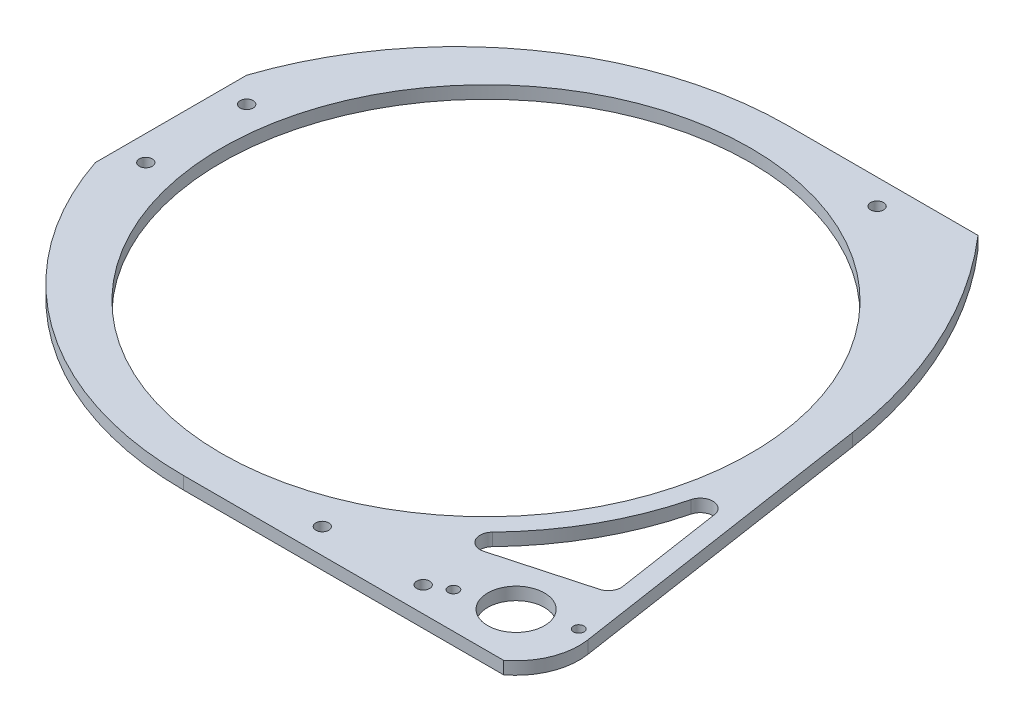
ISO-10303-21;
HEADER;
FILE_DESCRIPTION(('STEP AP214'),'2;1');
FILE_NAME('part.step','',(''),(''),'','','');
FILE_SCHEMA(('AUTOMOTIVE_DESIGN { 1 0 10303 214 1 1 1 1 }'));
ENDSEC;
DATA;
#1=APPLICATION_CONTEXT('core data for automotive mechanical design processes');
#2=APPLICATION_PROTOCOL_DEFINITION('international standard','automotive_design',2000,#1);
#3=PRODUCT_CONTEXT('',#1,'mechanical');
#4=PRODUCT('Part','Part','',(#3));
#5=PRODUCT_RELATED_PRODUCT_CATEGORY('part','',(#4));
#6=PRODUCT_DEFINITION_FORMATION('','',#4);
#7=PRODUCT_DEFINITION_CONTEXT('part definition',#1,'design');
#8=PRODUCT_DEFINITION('design','',#6,#7);
#9=PRODUCT_DEFINITION_SHAPE('','',#8);
#10=(LENGTH_UNIT() NAMED_UNIT(*) SI_UNIT(.MILLI.,.METRE.));
#11=(NAMED_UNIT(*) PLANE_ANGLE_UNIT() SI_UNIT($,.RADIAN.));
#12=(NAMED_UNIT(*) SI_UNIT($,.STERADIAN.) SOLID_ANGLE_UNIT());
#13=UNCERTAINTY_MEASURE_WITH_UNIT(LENGTH_MEASURE(1.E-05),#10,'distance_accuracy_value','');
#14=(GEOMETRIC_REPRESENTATION_CONTEXT(3) GLOBAL_UNCERTAINTY_ASSIGNED_CONTEXT((#13)) GLOBAL_UNIT_ASSIGNED_CONTEXT((#10,
#11,#12)) REPRESENTATION_CONTEXT('',''));
#15=CARTESIAN_POINT('',(0.,0.,0.));
#16=DIRECTION('',(0.,0.,1.));
#17=DIRECTION('',(1.,0.,0.));
#18=AXIS2_PLACEMENT_3D('',#15,#16,#17);
#19=CARTESIAN_POINT('',(-79.7640612472225,6.35,3.44169137633799E-12));
#20=DIRECTION('',(0.,-1.,0.));
#21=DIRECTION('',(0.,0.,-1.));
#22=AXIS2_PLACEMENT_3D('',#19,#20,#21);
#23=CYLINDRICAL_SURFACE('',#22,232.164061247223);
#24=CARTESIAN_POINT('',(-79.7640612472225,0.,3.44169137633799E-12));
#25=DIRECTION('',(0.,1.,0.));
#26=DIRECTION('',(0.,0.,1.));
#27=AXIS2_PLACEMENT_3D('',#24,#25,#26);
#28=CIRCLE('',#27,232.164061247223);
#29=CARTESIAN_POINT('',(95.377,0.,-152.4));
#30=VERTEX_POINT('',#29);
#31=CARTESIAN_POINT('',(149.78502738922,0.,-34.7471904041549));
#32=VERTEX_POINT('',#31);
#33=EDGE_CURVE('E147',#30,#32,#28,.F.);
#34=ORIENTED_EDGE('',*,*,#33,.F.);
#35=DIRECTION('',(0.,-1.,0.));
#36=VECTOR('',#35,1.);
#37=CARTESIAN_POINT('',(95.377,6.35,-152.4));
#38=LINE('',#37,#36);
#39=CARTESIAN_POINT('',(95.377,6.35,-152.4));
#40=VERTEX_POINT('',#39);
#41=EDGE_CURVE('E143',#40,#30,#38,.T.);
#42=ORIENTED_EDGE('',*,*,#41,.F.);
#43=CARTESIAN_POINT('',(-79.7640612472225,6.35,3.44169137633799E-12));
#44=DIRECTION('',(0.,1.,0.));
#45=DIRECTION('',(0.,0.,1.));
#46=AXIS2_PLACEMENT_3D('',#43,#44,#45);
#47=CIRCLE('',#46,232.164061247223);
#48=CARTESIAN_POINT('',(149.78502738922,6.35,-34.7471904041549));
#49=VERTEX_POINT('',#48);
#50=EDGE_CURVE('E145',#40,#49,#47,.F.);
#51=ORIENTED_EDGE('',*,*,#50,.T.);
#52=DIRECTION('',(0.,-1.,0.));
#53=VECTOR('',#52,1.);
#54=CARTESIAN_POINT('',(149.78502738922,6.35,-34.7471904041549));
#55=LINE('',#54,#53);
#56=EDGE_CURVE('E226',#49,#32,#55,.T.);
#57=ORIENTED_EDGE('',*,*,#56,.T.);
#58=EDGE_LOOP('',(#34,#42,#51,#57));
#59=FACE_BOUND('',#58,.T.);
#60=ADVANCED_FACE('F41',(#59),#23,.T.);
#61=CARTESIAN_POINT('',(0.,6.35,-152.4));
#62=DIRECTION('',(0.,0.,-1.));
#63=DIRECTION('',(-1.,0.,0.));
#64=AXIS2_PLACEMENT_3D('',#61,#62,#63);
#65=PLANE('',#64);
#66=DIRECTION('',(1.,0.,0.));
#67=VECTOR('',#66,1.);
#68=CARTESIAN_POINT('',(0.,0.,-152.4));
#69=LINE('',#68,#67);
#70=CARTESIAN_POINT('',(-5.25062936015364E-13,0.,-152.4));
#71=VERTEX_POINT('',#70);
#72=EDGE_CURVE('E234',#71,#30,#69,.T.);
#73=ORIENTED_EDGE('',*,*,#72,.F.);
#74=DIRECTION('',(0.,-1.,0.));
#75=VECTOR('',#74,1.);
#76=CARTESIAN_POINT('',(-5.25062936015364E-13,6.35,-152.4));
#77=LINE('',#76,#75);
#78=CARTESIAN_POINT('',(-5.25062936015364E-13,6.35,-152.4));
#79=VERTEX_POINT('',#78);
#80=EDGE_CURVE('E154',#79,#71,#77,.T.);
#81=ORIENTED_EDGE('',*,*,#80,.F.);
#82=DIRECTION('',(1.,0.,0.));
#83=VECTOR('',#82,1.);
#84=CARTESIAN_POINT('',(0.,6.35,-152.4));
#85=LINE('',#84,#83);
#86=EDGE_CURVE('E161',#79,#40,#85,.T.);
#87=ORIENTED_EDGE('',*,*,#86,.T.);
#88=ORIENTED_EDGE('',*,*,#41,.T.);
#89=EDGE_LOOP('',(#73,#81,#87,#88));
#90=FACE_BOUND('',#89,.T.);
#91=ADVANCED_FACE('F169',(#90),#65,.T.);
#92=CARTESIAN_POINT('',(0.,6.35,14.8167372222222));
#93=DIRECTION('',(0.,-1.,0.));
#94=DIRECTION('',(0.,0.,-1.));
#95=AXIS2_PLACEMENT_3D('',#92,#93,#94);
#96=CYLINDRICAL_SURFACE('',#95,167.216737222222);
#97=CARTESIAN_POINT('',(0.,0.,14.8167372222222));
#98=DIRECTION('',(0.,1.,0.));
#99=DIRECTION('',(0.,0.,1.));
#100=AXIS2_PLACEMENT_3D('',#97,#98,#99);
#101=CIRCLE('',#100,167.216737222222);
#102=CARTESIAN_POINT('',(-158.623,0.,-38.1));
#103=VERTEX_POINT('',#102);
#104=EDGE_CURVE('E237',#103,#71,#101,.F.);
#105=ORIENTED_EDGE('',*,*,#104,.F.);
#106=DIRECTION('',(0.,-1.,0.));
#107=VECTOR('',#106,1.);
#108=CARTESIAN_POINT('',(-158.623,6.35,-38.1));
#109=LINE('',#108,#107);
#110=CARTESIAN_POINT('',(-158.623,6.35,-38.1));
#111=VERTEX_POINT('',#110);
#112=EDGE_CURVE('E311',#111,#103,#109,.T.);
#113=ORIENTED_EDGE('',*,*,#112,.F.);
#114=CARTESIAN_POINT('',(0.,6.35,14.8167372222222));
#115=DIRECTION('',(0.,1.,0.));
#116=DIRECTION('',(0.,0.,1.));
#117=AXIS2_PLACEMENT_3D('',#114,#115,#116);
#118=CIRCLE('',#117,167.216737222222);
#119=EDGE_CURVE('E171',#111,#79,#118,.F.);
#120=ORIENTED_EDGE('',*,*,#119,.T.);
#121=ORIENTED_EDGE('',*,*,#80,.T.);
#122=EDGE_LOOP('',(#105,#113,#120,#121));
#123=FACE_BOUND('',#122,.T.);
#124=ADVANCED_FACE('F403',(#123),#96,.T.);
#125=CARTESIAN_POINT('',(-158.623,6.35,0.));
#126=DIRECTION('',(1.,0.,0.));
#127=DIRECTION('',(0.,0.,-1.));
#128=AXIS2_PLACEMENT_3D('',#125,#126,#127);
#129=PLANE('',#128);
#130=DIRECTION('',(0.,0.,1.));
#131=VECTOR('',#130,1.);
#132=CARTESIAN_POINT('',(-158.623,0.,0.));
#133=LINE('',#132,#131);
#134=CARTESIAN_POINT('',(-158.623,0.,38.1));
#135=VERTEX_POINT('',#134);
#136=EDGE_CURVE('E241',#103,#135,#133,.T.);
#137=ORIENTED_EDGE('',*,*,#136,.T.);
#138=DIRECTION('',(0.,-1.,0.));
#139=VECTOR('',#138,1.);
#140=CARTESIAN_POINT('',(-158.623,6.35,38.1));
#141=LINE('',#140,#139);
#142=CARTESIAN_POINT('',(-158.623,6.35,38.1));
#143=VERTEX_POINT('',#142);
#144=EDGE_CURVE('E307',#143,#135,#141,.T.);
#145=ORIENTED_EDGE('',*,*,#144,.F.);
#146=DIRECTION('',(0.,0.,1.));
#147=VECTOR('',#146,1.);
#148=CARTESIAN_POINT('',(-158.623,6.35,0.));
#149=LINE('',#148,#147);
#150=EDGE_CURVE('E174',#111,#143,#149,.T.);
#151=ORIENTED_EDGE('',*,*,#150,.F.);
#152=ORIENTED_EDGE('',*,*,#112,.T.);
#153=EDGE_LOOP('',(#137,#145,#151,#152));
#154=FACE_BOUND('',#153,.T.);
#155=ADVANCED_FACE('F566',(#154),#129,.F.);
#156=CARTESIAN_POINT('',(0.,6.35,-14.8167372222222));
#157=DIRECTION('',(0.,-1.,0.));
#158=DIRECTION('',(0.,0.,-1.));
#159=AXIS2_PLACEMENT_3D('',#156,#157,#158);
#160=CYLINDRICAL_SURFACE('',#159,167.216737222222);
#161=CARTESIAN_POINT('',(0.,0.,-14.8167372222222));
#162=DIRECTION('',(0.,1.,0.));
#163=DIRECTION('',(0.,0.,1.));
#164=AXIS2_PLACEMENT_3D('',#161,#162,#163);
#165=CIRCLE('',#164,167.216737222222);
#166=CARTESIAN_POINT('',(5.25062942183422E-13,0.,152.4));
#167=VERTEX_POINT('',#166);
#168=EDGE_CURVE('E245',#135,#167,#165,.T.);
#169=ORIENTED_EDGE('',*,*,#168,.T.);
#170=DIRECTION('',(0.,-1.,0.));
#171=VECTOR('',#170,1.);
#172=CARTESIAN_POINT('',(5.25062942183422E-13,6.35,152.4));
#173=LINE('',#172,#171);
#174=CARTESIAN_POINT('',(5.25062942183422E-13,6.35,152.4));
#175=VERTEX_POINT('',#174);
#176=EDGE_CURVE('E303',#175,#167,#173,.T.);
#177=ORIENTED_EDGE('',*,*,#176,.F.);
#178=CARTESIAN_POINT('',(0.,6.35,-14.8167372222222));
#179=DIRECTION('',(0.,1.,0.));
#180=DIRECTION('',(0.,0.,1.));
#181=AXIS2_PLACEMENT_3D('',#178,#179,#180);
#182=CIRCLE('',#181,167.216737222222);
#183=EDGE_CURVE('E181',#143,#175,#182,.T.);
#184=ORIENTED_EDGE('',*,*,#183,.F.);
#185=ORIENTED_EDGE('',*,*,#144,.T.);
#186=EDGE_LOOP('',(#169,#177,#184,#185));
#187=FACE_BOUND('',#186,.T.);
#188=ADVANCED_FACE('F555',(#187),#160,.T.);
#189=CARTESIAN_POINT('',(0.,6.35,152.4));
#190=DIRECTION('',(0.,0.,-1.));
#191=DIRECTION('',(-1.,0.,0.));
#192=AXIS2_PLACEMENT_3D('',#189,#190,#191);
#193=PLANE('',#192);
#194=DIRECTION('',(1.,0.,0.));
#195=VECTOR('',#194,1.);
#196=CARTESIAN_POINT('',(0.,0.,152.4));
#197=LINE('',#196,#195);
#198=CARTESIAN_POINT('',(161.207253597175,0.,152.4));
#199=VERTEX_POINT('',#198);
#200=EDGE_CURVE('E249',#167,#199,#197,.T.);
#201=ORIENTED_EDGE('',*,*,#200,.T.);
#202=DIRECTION('',(0.,-1.,0.));
#203=VECTOR('',#202,1.);
#204=CARTESIAN_POINT('',(161.207253597175,6.35,152.4));
#205=LINE('',#204,#203);
#206=CARTESIAN_POINT('',(161.207253597175,6.35,152.4));
#207=VERTEX_POINT('',#206);
#208=EDGE_CURVE('E299',#207,#199,#205,.T.);
#209=ORIENTED_EDGE('',*,*,#208,.F.);
#210=DIRECTION('',(1.,0.,0.));
#211=VECTOR('',#210,1.);
#212=CARTESIAN_POINT('',(0.,6.35,152.4));
#213=LINE('',#212,#211);
#214=EDGE_CURVE('E185',#175,#207,#213,.T.);
#215=ORIENTED_EDGE('',*,*,#214,.F.);
#216=ORIENTED_EDGE('',*,*,#176,.T.);
#217=EDGE_LOOP('',(#201,#209,#215,#216));
#218=FACE_BOUND('',#217,.T.);
#219=ADVANCED_FACE('F545',(#218),#193,.F.);
#220=CARTESIAN_POINT('',(142.157253597175,6.35,127.));
#221=DIRECTION('',(0.,-1.,0.));
#222=DIRECTION('',(0.,0.,-1.));
#223=AXIS2_PLACEMENT_3D('',#220,#221,#222);
#224=CYLINDRICAL_SURFACE('',#223,31.75);
#225=CARTESIAN_POINT('',(142.157253597175,0.,127.));
#226=DIRECTION('',(0.,1.,0.));
#227=DIRECTION('',(0.,0.,1.));
#228=AXIS2_PLACEMENT_3D('',#225,#226,#227);
#229=CIRCLE('',#228,31.75);
#230=CARTESIAN_POINT('',(173.549638469553,0.,122.248087540314));
#231=VERTEX_POINT('',#230);
#232=EDGE_CURVE('E253',#199,#231,#229,.T.);
#233=ORIENTED_EDGE('',*,*,#232,.T.);
#234=DIRECTION('',(0.,-1.,0.));
#235=VECTOR('',#234,1.);
#236=CARTESIAN_POINT('',(173.549638469553,6.35,122.248087540314));
#237=LINE('',#236,#235);
#238=CARTESIAN_POINT('',(173.549638469553,6.35,122.248087540314));
#239=VERTEX_POINT('',#238);
#240=EDGE_CURVE('E295',#239,#231,#237,.T.);
#241=ORIENTED_EDGE('',*,*,#240,.F.);
#242=CARTESIAN_POINT('',(142.157253597175,6.35,127.));
#243=DIRECTION('',(0.,1.,0.));
#244=DIRECTION('',(0.,0.,1.));
#245=AXIS2_PLACEMENT_3D('',#242,#243,#244);
#246=CIRCLE('',#245,31.75);
#247=EDGE_CURVE('E189',#207,#239,#246,.T.);
#248=ORIENTED_EDGE('',*,*,#247,.F.);
#249=ORIENTED_EDGE('',*,*,#208,.T.);
#250=EDGE_LOOP('',(#233,#241,#248,#249));
#251=FACE_BOUND('',#250,.T.);
#252=ADVANCED_FACE('F535',(#251),#224,.T.);
#253=CARTESIAN_POINT('',(-145.923,6.35,-25.4));
#254=DIRECTION('',(0.,-1.,0.));
#255=DIRECTION('',(0.,0.,-1.));
#256=AXIS2_PLACEMENT_3D('',#253,#254,#255);
#257=CYLINDRICAL_SURFACE('',#256,3.26390000000001);
#258=CARTESIAN_POINT('',(-145.923,6.35,-25.4));
#259=DIRECTION('',(0.,1.,0.));
#260=DIRECTION('',(0.,0.,1.));
#261=AXIS2_PLACEMENT_3D('',#258,#259,#260);
#262=CIRCLE('',#261,3.26390000000001);
#263=CARTESIAN_POINT('',(-145.923,6.35,-22.1361));
#264=VERTEX_POINT('',#263);
#265=EDGE_CURVE('E218',#264,#264,#262,.T.);
#266=ORIENTED_EDGE('',*,*,#265,.T.);
#267=EDGE_LOOP('',(#266));
#268=FACE_BOUND('',#267,.T.);
#269=CARTESIAN_POINT('',(-145.923,0.,-25.4));
#270=DIRECTION('',(0.,1.,0.));
#271=DIRECTION('',(0.,0.,1.));
#272=AXIS2_PLACEMENT_3D('',#269,#270,#271);
#273=CIRCLE('',#272,3.26390000000001);
#274=CARTESIAN_POINT('',(-145.923,0.,-22.1361));
#275=VERTEX_POINT('',#274);
#276=EDGE_CURVE('E285',#275,#275,#273,.T.);
#277=ORIENTED_EDGE('',*,*,#276,.F.);
#278=EDGE_LOOP('',(#277));
#279=FACE_BOUND('',#278,.T.);
#280=ADVANCED_FACE('F525',(#268,#279),#257,.F.);
#281=CARTESIAN_POINT('',(-145.923,6.35,25.4));
#282=DIRECTION('',(0.,-1.,0.));
#283=DIRECTION('',(0.,0.,-1.));
#284=AXIS2_PLACEMENT_3D('',#281,#282,#283);
#285=CYLINDRICAL_SURFACE('',#284,3.26390000000001);
#286=CARTESIAN_POINT('',(-145.923,6.35,25.4));
#287=DIRECTION('',(0.,1.,0.));
#288=DIRECTION('',(0.,0.,1.));
#289=AXIS2_PLACEMENT_3D('',#286,#287,#288);
#290=CIRCLE('',#289,3.26390000000001);
#291=CARTESIAN_POINT('',(-145.923,6.35,28.6639));
#292=VERTEX_POINT('',#291);
#293=EDGE_CURVE('E214',#292,#292,#290,.T.);
#294=ORIENTED_EDGE('',*,*,#293,.T.);
#295=EDGE_LOOP('',(#294));
#296=FACE_BOUND('',#295,.T.);
#297=CARTESIAN_POINT('',(-145.923,0.,25.4));
#298=DIRECTION('',(0.,1.,0.));
#299=DIRECTION('',(0.,0.,1.));
#300=AXIS2_PLACEMENT_3D('',#297,#298,#299);
#301=CIRCLE('',#300,3.26390000000001);
#302=CARTESIAN_POINT('',(-145.923,0.,28.6639));
#303=VERTEX_POINT('',#302);
#304=EDGE_CURVE('E281',#303,#303,#301,.T.);
#305=ORIENTED_EDGE('',*,*,#304,.F.);
#306=EDGE_LOOP('',(#305));
#307=FACE_BOUND('',#306,.T.);
#308=ADVANCED_FACE('F515',(#296,#307),#285,.F.);
#309=CARTESIAN_POINT('',(57.2769999999999,6.35,-139.7));
#310=DIRECTION('',(0.,-1.,0.));
#311=DIRECTION('',(0.,0.,-1.));
#312=AXIS2_PLACEMENT_3D('',#309,#310,#311);
#313=CYLINDRICAL_SURFACE('',#312,3.2639);
#314=CARTESIAN_POINT('',(57.2769999999999,6.35,-139.7));
#315=DIRECTION('',(0.,1.,0.));
#316=DIRECTION('',(0.,0.,1.));
#317=AXIS2_PLACEMENT_3D('',#314,#315,#316);
#318=CIRCLE('',#317,3.2639);
#319=CARTESIAN_POINT('',(57.2769999999999,6.35,-136.4361));
#320=VERTEX_POINT('',#319);
#321=EDGE_CURVE('E210',#320,#320,#318,.T.);
#322=ORIENTED_EDGE('',*,*,#321,.T.);
#323=EDGE_LOOP('',(#322));
#324=FACE_BOUND('',#323,.T.);
#325=CARTESIAN_POINT('',(57.2769999999999,0.,-139.7));
#326=DIRECTION('',(0.,1.,0.));
#327=DIRECTION('',(0.,0.,1.));
#328=AXIS2_PLACEMENT_3D('',#325,#326,#327);
#329=CIRCLE('',#328,3.2639);
#330=CARTESIAN_POINT('',(57.2769999999999,0.,-136.4361));
#331=VERTEX_POINT('',#330);
#332=EDGE_CURVE('E277',#331,#331,#329,.T.);
#333=ORIENTED_EDGE('',*,*,#332,.F.);
#334=EDGE_LOOP('',(#333));
#335=FACE_BOUND('',#334,.T.);
#336=ADVANCED_FACE('F505',(#324,#335),#313,.F.);
#337=CARTESIAN_POINT('',(57.277,6.35,139.7));
#338=DIRECTION('',(0.,-1.,0.));
#339=DIRECTION('',(0.,0.,-1.));
#340=AXIS2_PLACEMENT_3D('',#337,#338,#339);
#341=CYLINDRICAL_SURFACE('',#340,3.2639);
#342=CARTESIAN_POINT('',(57.277,6.35,139.7));
#343=DIRECTION('',(0.,1.,0.));
#344=DIRECTION('',(0.,0.,1.));
#345=AXIS2_PLACEMENT_3D('',#342,#343,#344);
#346=CIRCLE('',#345,3.2639);
#347=CARTESIAN_POINT('',(57.277,6.35,142.9639));
#348=VERTEX_POINT('',#347);
#349=EDGE_CURVE('E206',#348,#348,#346,.T.);
#350=ORIENTED_EDGE('',*,*,#349,.T.);
#351=EDGE_LOOP('',(#350));
#352=FACE_BOUND('',#351,.T.);
#353=CARTESIAN_POINT('',(57.277,0.,139.7));
#354=DIRECTION('',(0.,1.,0.));
#355=DIRECTION('',(0.,0.,1.));
#356=AXIS2_PLACEMENT_3D('',#353,#354,#355);
#357=CIRCLE('',#356,3.2639);
#358=CARTESIAN_POINT('',(57.277,0.,142.9639));
#359=VERTEX_POINT('',#358);
#360=EDGE_CURVE('E273',#359,#359,#357,.T.);
#361=ORIENTED_EDGE('',*,*,#360,.F.);
#362=EDGE_LOOP('',(#361));
#363=FACE_BOUND('',#362,.T.);
#364=ADVANCED_FACE('F495',(#352,#363),#341,.F.);
#365=CARTESIAN_POINT('',(117.797598231343,6.35,134.194942005177));
#366=DIRECTION('',(0.,-1.,0.));
#367=DIRECTION('',(0.,0.,-1.));
#368=AXIS2_PLACEMENT_3D('',#365,#366,#367);
#369=CYLINDRICAL_SURFACE('',#368,2.62890000000002);
#370=CARTESIAN_POINT('',(117.797598231343,6.35,134.194942005177));
#371=DIRECTION('',(0.,1.,0.));
#372=DIRECTION('',(0.,0.,1.));
#373=AXIS2_PLACEMENT_3D('',#370,#371,#372);
#374=CIRCLE('',#373,2.62890000000002);
#375=CARTESIAN_POINT('',(117.797598231343,6.35,136.823842005177));
#376=VERTEX_POINT('',#375);
#377=EDGE_CURVE('E202',#376,#376,#374,.T.);
#378=ORIENTED_EDGE('',*,*,#377,.T.);
#379=EDGE_LOOP('',(#378));
#380=FACE_BOUND('',#379,.T.);
#381=CARTESIAN_POINT('',(117.797598231343,0.,134.194942005177));
#382=DIRECTION('',(0.,1.,0.));
#383=DIRECTION('',(0.,0.,1.));
#384=AXIS2_PLACEMENT_3D('',#381,#382,#383);
#385=CIRCLE('',#384,2.62890000000002);
#386=CARTESIAN_POINT('',(117.797598231343,0.,136.823842005177));
#387=VERTEX_POINT('',#386);
#388=EDGE_CURVE('E269',#387,#387,#385,.T.);
#389=ORIENTED_EDGE('',*,*,#388,.F.);
#390=EDGE_LOOP('',(#389));
#391=FACE_BOUND('',#390,.T.);
#392=ADVANCED_FACE('F485',(#380,#391),#369,.F.);
#393=CARTESIAN_POINT('',(166.516908963008,6.35,119.805057994823));
#394=DIRECTION('',(0.,-1.,0.));
#395=DIRECTION('',(0.,0.,-1.));
#396=AXIS2_PLACEMENT_3D('',#393,#394,#395);
#397=CYLINDRICAL_SURFACE('',#396,2.62890000000002);
#398=CARTESIAN_POINT('',(166.516908963008,6.35,119.805057994823));
#399=DIRECTION('',(0.,1.,0.));
#400=DIRECTION('',(0.,0.,1.));
#401=AXIS2_PLACEMENT_3D('',#398,#399,#400);
#402=CIRCLE('',#401,2.62890000000002);
#403=CARTESIAN_POINT('',(166.516908963008,6.35,122.433957994823));
#404=VERTEX_POINT('',#403);
#405=EDGE_CURVE('E198',#404,#404,#402,.T.);
#406=ORIENTED_EDGE('',*,*,#405,.T.);
#407=EDGE_LOOP('',(#406));
#408=FACE_BOUND('',#407,.T.);
#409=CARTESIAN_POINT('',(166.516908963008,0.,119.805057994823));
#410=DIRECTION('',(0.,1.,0.));
#411=DIRECTION('',(0.,0.,1.));
#412=AXIS2_PLACEMENT_3D('',#409,#410,#411);
#413=CIRCLE('',#412,2.62890000000002);
#414=CARTESIAN_POINT('',(166.516908963008,0.,122.433957994823));
#415=VERTEX_POINT('',#414);
#416=EDGE_CURVE('E265',#415,#415,#413,.T.);
#417=ORIENTED_EDGE('',*,*,#416,.F.);
#418=EDGE_LOOP('',(#417));
#419=FACE_BOUND('',#418,.T.);
#420=ADVANCED_FACE('F475',(#408,#419),#397,.F.);
#421=CARTESIAN_POINT('',(142.157253597175,6.35,127.));
#422=DIRECTION('',(0.,-1.,0.));
#423=DIRECTION('',(0.,0.,-1.));
#424=AXIS2_PLACEMENT_3D('',#421,#422,#423);
#425=CYLINDRICAL_SURFACE('',#424,14.2875);
#426=CARTESIAN_POINT('',(142.157253597175,6.35,127.));
#427=DIRECTION('',(0.,1.,0.));
#428=DIRECTION('',(0.,0.,1.));
#429=AXIS2_PLACEMENT_3D('',#426,#427,#428);
#430=CIRCLE('',#429,14.2875);
#431=CARTESIAN_POINT('',(142.157253597175,6.35,141.2875));
#432=VERTEX_POINT('',#431);
#433=EDGE_CURVE('E194',#432,#432,#430,.T.);
#434=ORIENTED_EDGE('',*,*,#433,.T.);
#435=EDGE_LOOP('',(#434));
#436=FACE_BOUND('',#435,.T.);
#437=CARTESIAN_POINT('',(142.157253597175,0.,127.));
#438=DIRECTION('',(0.,1.,0.));
#439=DIRECTION('',(0.,0.,1.));
#440=AXIS2_PLACEMENT_3D('',#437,#438,#439);
#441=CIRCLE('',#440,14.2875);
#442=CARTESIAN_POINT('',(142.157253597175,0.,141.2875));
#443=VERTEX_POINT('',#442);
#444=EDGE_CURVE('E261',#443,#443,#441,.T.);
#445=ORIENTED_EDGE('',*,*,#444,.F.);
#446=EDGE_LOOP('',(#445));
#447=FACE_BOUND('',#446,.T.);
#448=ADVANCED_FACE('F465',(#436,#447),#425,.F.);
#449=CARTESIAN_POINT('',(151.571748060178,6.35,-22.9436432138447));
#450=DIRECTION('',(-0.988736531413468,0.,0.149666534163335));
#451=DIRECTION('',(0.149666534163335,0.,0.988736531413468));
#452=AXIS2_PLACEMENT_3D('',#449,#450,#451);
#453=PLANE('',#452);
#454=DIRECTION('',(-0.149666534163335,0.,-0.988736531413468));
#455=VECTOR('',#454,1.);
#456=CARTESIAN_POINT('',(151.571748060178,0.,-22.9436432138447));
#457=LINE('',#456,#455);
#458=EDGE_CURVE('E257',#231,#32,#457,.T.);
#459=ORIENTED_EDGE('',*,*,#458,.T.);
#460=ORIENTED_EDGE('',*,*,#56,.F.);
#461=DIRECTION('',(-0.149666534163335,0.,-0.988736531413468));
#462=VECTOR('',#461,1.);
#463=CARTESIAN_POINT('',(151.571748060178,6.35,-22.9436432138447));
#464=LINE('',#463,#462);
#465=EDGE_CURVE('E164',#239,#49,#464,.T.);
#466=ORIENTED_EDGE('',*,*,#465,.F.);
#467=ORIENTED_EDGE('',*,*,#240,.T.);
#468=EDGE_LOOP('',(#459,#460,#466,#467));
#469=FACE_BOUND('',#468,.T.);
#470=ADVANCED_FACE('F409',(#469),#453,.F.);
#471=CARTESIAN_POINT('',(108.077,6.35,139.7));
#472=DIRECTION('',(0.,-1.,0.));
#473=DIRECTION('',(0.,0.,-1.));
#474=AXIS2_PLACEMENT_3D('',#471,#472,#473);
#475=CYLINDRICAL_SURFACE('',#474,3.26389999999999);
#476=CARTESIAN_POINT('',(108.077,6.35,139.7));
#477=DIRECTION('',(0.,1.,0.));
#478=DIRECTION('',(0.,0.,1.));
#479=AXIS2_PLACEMENT_3D('',#476,#477,#478);
#480=CIRCLE('',#479,3.26389999999999);
#481=CARTESIAN_POINT('',(108.077,6.35,142.9639));
#482=VERTEX_POINT('',#481);
#483=EDGE_CURVE('E167',#482,#482,#480,.T.);
#484=ORIENTED_EDGE('',*,*,#483,.T.);
#485=EDGE_LOOP('',(#484));
#486=FACE_BOUND('',#485,.T.);
#487=CARTESIAN_POINT('',(108.077,0.,139.7));
#488=DIRECTION('',(0.,1.,0.));
#489=DIRECTION('',(0.,0.,1.));
#490=AXIS2_PLACEMENT_3D('',#487,#488,#489);
#491=CIRCLE('',#490,3.26389999999999);
#492=CARTESIAN_POINT('',(108.077,0.,142.9639));
#493=VERTEX_POINT('',#492);
#494=EDGE_CURVE('E227',#493,#493,#491,.T.);
#495=ORIENTED_EDGE('',*,*,#494,.F.);
#496=EDGE_LOOP('',(#495));
#497=FACE_BOUND('',#496,.T.);
#498=ADVANCED_FACE('F384',(#486,#497),#475,.F.);
#499=CARTESIAN_POINT('',(0.,6.35,0.));
#500=DIRECTION('',(0.,-1.,0.));
#501=DIRECTION('',(0.,0.,-1.));
#502=AXIS2_PLACEMENT_3D('',#499,#500,#501);
#503=CYLINDRICAL_SURFACE('',#502,133.223);
#504=CARTESIAN_POINT('',(0.,6.35,0.));
#505=DIRECTION('',(0.,1.,0.));
#506=DIRECTION('',(0.,0.,1.));
#507=AXIS2_PLACEMENT_3D('',#504,#505,#506);
#508=CIRCLE('',#507,133.223);
#509=CARTESIAN_POINT('',(0.,6.35,133.223));
#510=VERTEX_POINT('',#509);
#511=EDGE_CURVE('E222',#510,#510,#508,.T.);
#512=ORIENTED_EDGE('',*,*,#511,.T.);
#513=EDGE_LOOP('',(#512));
#514=FACE_BOUND('',#513,.T.);
#515=CARTESIAN_POINT('',(0.,0.,0.));
#516=DIRECTION('',(0.,1.,0.));
#517=DIRECTION('',(0.,0.,1.));
#518=AXIS2_PLACEMENT_3D('',#515,#516,#517);
#519=CIRCLE('',#518,133.223);
#520=CARTESIAN_POINT('',(0.,0.,133.223));
#521=VERTEX_POINT('',#520);
#522=EDGE_CURVE('E289',#521,#521,#519,.T.);
#523=ORIENTED_EDGE('',*,*,#522,.F.);
#524=EDGE_LOOP('',(#523));
#525=FACE_BOUND('',#524,.T.);
#526=ADVANCED_FACE('F388',(#514,#525),#503,.F.);
#527=CARTESIAN_POINT('',(0.,6.35,0.));
#528=DIRECTION('',(0.,1.,0.));
#529=DIRECTION('',(0.,0.,1.));
#530=AXIS2_PLACEMENT_3D('',#527,#528,#529);
#531=PLANE('',#530);
#532=CARTESIAN_POINT('',(0.,6.35,0.));
#533=DIRECTION('',(0.,-1.,0.));
#534=DIRECTION('',(0.,0.,1.));
#535=AXIS2_PLACEMENT_3D('',#532,#533,#534);
#536=CIRCLE('',#535,142.748);
#537=CARTESIAN_POINT('',(138.376164520593,6.35,35.0575041406216));
#538=VERTEX_POINT('',#537);
#539=CARTESIAN_POINT('',(102.544438505482,6.35,99.3057381806078));
#540=VERTEX_POINT('',#539);
#541=EDGE_CURVE('E352',#538,#540,#536,.T.);
#542=ORIENTED_EDGE('',*,*,#541,.F.);
#543=CARTESIAN_POINT('',(144.53168785336,6.35,36.6170016557738));
#544=DIRECTION('',(0.,1.,0.));
#545=DIRECTION('',(0.,0.,1.));
#546=AXIS2_PLACEMENT_3D('',#543,#544,#545);
#547=CIRCLE('',#546,6.35);
#548=CARTESIAN_POINT('',(150.810164827835,6.35,35.6666191638367));
#549=VERTEX_POINT('',#548);
#550=EDGE_CURVE('E335',#538,#549,#547,.F.);
#551=ORIENTED_EDGE('',*,*,#550,.T.);
#552=DIRECTION('',(-0.149666534163335,0.,-0.988736531413468));
#553=VECTOR('',#552,1.);
#554=CARTESIAN_POINT('',(142.748,6.35,-17.5941644316346));
#555=LINE('',#554,#553);
#556=CARTESIAN_POINT('',(159.063326188936,6.35,90.1891761468455));
#557=VERTEX_POINT('',#556);
#558=EDGE_CURVE('E373',#557,#549,#555,.T.);
#559=ORIENTED_EDGE('',*,*,#558,.F.);
#560=CARTESIAN_POINT('',(152.78484921446,6.35,91.1395586387826));
#561=DIRECTION('',(0.,1.,0.));
#562=DIRECTION('',(0.,0.,1.));
#563=AXIS2_PLACEMENT_3D('',#560,#561,#562);
#564=CIRCLE('',#563,6.35);
#565=CARTESIAN_POINT('',(154.471336080676,6.35,97.26150784227));
#566=VERTEX_POINT('',#565);
#567=EDGE_CURVE('E341',#557,#566,#564,.F.);
#568=ORIENTED_EDGE('',*,*,#567,.T.);
#569=DIRECTION('',(0.964086488738167,0.,-0.265588482868727));
#570=VECTOR('',#569,1.);
#571=CARTESIAN_POINT('',(81.0963370257868,6.35,117.475));
#572=LINE('',#571,#570);
#573=CARTESIAN_POINT('',(108.792510714469,6.35,109.845202427716));
#574=VERTEX_POINT('',#573);
#575=EDGE_CURVE('E353',#574,#566,#572,.T.);
#576=ORIENTED_EDGE('',*,*,#575,.F.);
#577=CARTESIAN_POINT('',(107.106023848253,6.35,103.723253224229));
#578=DIRECTION('',(0.,1.,0.));
#579=DIRECTION('',(0.,0.,1.));
#580=AXIS2_PLACEMENT_3D('',#577,#578,#579);
#581=CIRCLE('',#580,6.35);
#582=EDGE_CURVE('E50',#574,#540,#581,.F.);
#583=ORIENTED_EDGE('',*,*,#582,.T.);
#584=EDGE_LOOP('',(#542,#551,#559,#568,#576,#583));
#585=FACE_BOUND('',#584,.T.);
#586=ORIENTED_EDGE('',*,*,#483,.F.);
#587=EDGE_LOOP('',(#586));
#588=FACE_BOUND('',#587,.T.);
#589=ORIENTED_EDGE('',*,*,#50,.F.);
#590=ORIENTED_EDGE('',*,*,#86,.F.);
#591=ORIENTED_EDGE('',*,*,#119,.F.);
#592=ORIENTED_EDGE('',*,*,#150,.T.);
#593=ORIENTED_EDGE('',*,*,#183,.T.);
#594=ORIENTED_EDGE('',*,*,#214,.T.);
#595=ORIENTED_EDGE('',*,*,#247,.T.);
#596=ORIENTED_EDGE('',*,*,#465,.T.);
#597=EDGE_LOOP('',(#589,#590,#591,#592,#593,#594,#595,#596));
#598=FACE_BOUND('',#597,.T.);
#599=ORIENTED_EDGE('',*,*,#433,.F.);
#600=EDGE_LOOP('',(#599));
#601=FACE_BOUND('',#600,.T.);
#602=ORIENTED_EDGE('',*,*,#405,.F.);
#603=EDGE_LOOP('',(#602));
#604=FACE_BOUND('',#603,.T.);
#605=ORIENTED_EDGE('',*,*,#377,.F.);
#606=EDGE_LOOP('',(#605));
#607=FACE_BOUND('',#606,.T.);
#608=ORIENTED_EDGE('',*,*,#349,.F.);
#609=EDGE_LOOP('',(#608));
#610=FACE_BOUND('',#609,.T.);
#611=ORIENTED_EDGE('',*,*,#321,.F.);
#612=EDGE_LOOP('',(#611));
#613=FACE_BOUND('',#612,.T.);
#614=ORIENTED_EDGE('',*,*,#293,.F.);
#615=EDGE_LOOP('',(#614));
#616=FACE_BOUND('',#615,.T.);
#617=ORIENTED_EDGE('',*,*,#265,.F.);
#618=EDGE_LOOP('',(#617));
#619=FACE_BOUND('',#618,.T.);
#620=ORIENTED_EDGE('',*,*,#511,.F.);
#621=EDGE_LOOP('',(#620));
#622=FACE_BOUND('',#621,.T.);
#623=ADVANCED_FACE('F158',(#585,#588,#598,#601,#604,#607,#610,#613,#616,#619,#622),#531,.T.);
#624=CARTESIAN_POINT('',(0.,0.,0.));
#625=DIRECTION('',(0.,1.,0.));
#626=DIRECTION('',(0.,0.,1.));
#627=AXIS2_PLACEMENT_3D('',#624,#625,#626);
#628=PLANE('',#627);
#629=DIRECTION('',(-0.149666534163335,0.,-0.988736531413468));
#630=VECTOR('',#629,1.);
#631=CARTESIAN_POINT('',(142.748,0.,-17.5941644316346));
#632=LINE('',#631,#630);
#633=CARTESIAN_POINT('',(159.063326188936,0.,90.1891761468455));
#634=VERTEX_POINT('',#633);
#635=CARTESIAN_POINT('',(150.810164827835,0.,35.6666191638367));
#636=VERTEX_POINT('',#635);
#637=EDGE_CURVE('E231',#634,#636,#632,.T.);
#638=ORIENTED_EDGE('',*,*,#637,.T.);
#639=CARTESIAN_POINT('',(144.53168785336,0.,36.6170016557738));
#640=DIRECTION('',(0.,1.,0.));
#641=DIRECTION('',(0.,0.,1.));
#642=AXIS2_PLACEMENT_3D('',#639,#640,#641);
#643=CIRCLE('',#642,6.35);
#644=CARTESIAN_POINT('',(138.376164520593,0.,35.0575041406216));
#645=VERTEX_POINT('',#644);
#646=EDGE_CURVE('E338',#636,#645,#643,.T.);
#647=ORIENTED_EDGE('',*,*,#646,.T.);
#648=CARTESIAN_POINT('',(0.,0.,0.));
#649=DIRECTION('',(0.,-1.,0.));
#650=DIRECTION('',(0.,0.,1.));
#651=AXIS2_PLACEMENT_3D('',#648,#649,#650);
#652=CIRCLE('',#651,142.748);
#653=CARTESIAN_POINT('',(102.544438505482,0.,99.3057381806078));
#654=VERTEX_POINT('',#653);
#655=EDGE_CURVE('E367',#645,#654,#652,.T.);
#656=ORIENTED_EDGE('',*,*,#655,.T.);
#657=CARTESIAN_POINT('',(107.106023848253,0.,103.723253224229));
#658=DIRECTION('',(0.,1.,0.));
#659=DIRECTION('',(0.,0.,1.));
#660=AXIS2_PLACEMENT_3D('',#657,#658,#659);
#661=CIRCLE('',#660,6.35);
#662=CARTESIAN_POINT('',(108.792510714469,0.,109.845202427716));
#663=VERTEX_POINT('',#662);
#664=EDGE_CURVE('E11',#654,#663,#661,.T.);
#665=ORIENTED_EDGE('',*,*,#664,.T.);
#666=DIRECTION('',(0.964086488738167,0.,-0.265588482868727));
#667=VECTOR('',#666,1.);
#668=CARTESIAN_POINT('',(81.0963370257868,0.,117.475));
#669=LINE('',#668,#667);
#670=CARTESIAN_POINT('',(154.471336080676,0.,97.26150784227));
#671=VERTEX_POINT('',#670);
#672=EDGE_CURVE('E364',#663,#671,#669,.T.);
#673=ORIENTED_EDGE('',*,*,#672,.T.);
#674=CARTESIAN_POINT('',(152.78484921446,0.,91.1395586387826));
#675=DIRECTION('',(0.,1.,0.));
#676=DIRECTION('',(0.,0.,1.));
#677=AXIS2_PLACEMENT_3D('',#674,#675,#676);
#678=CIRCLE('',#677,6.35);
#679=EDGE_CURVE('E344',#671,#634,#678,.T.);
#680=ORIENTED_EDGE('',*,*,#679,.T.);
#681=EDGE_LOOP('',(#638,#647,#656,#665,#673,#680));
#682=FACE_BOUND('',#681,.T.);
#683=ORIENTED_EDGE('',*,*,#494,.T.);
#684=EDGE_LOOP('',(#683));
#685=FACE_BOUND('',#684,.T.);
#686=ORIENTED_EDGE('',*,*,#33,.T.);
#687=ORIENTED_EDGE('',*,*,#458,.F.);
#688=ORIENTED_EDGE('',*,*,#232,.F.);
#689=ORIENTED_EDGE('',*,*,#200,.F.);
#690=ORIENTED_EDGE('',*,*,#168,.F.);
#691=ORIENTED_EDGE('',*,*,#136,.F.);
#692=ORIENTED_EDGE('',*,*,#104,.T.);
#693=ORIENTED_EDGE('',*,*,#72,.T.);
#694=EDGE_LOOP('',(#686,#687,#688,#689,#690,#691,#692,#693));
#695=FACE_BOUND('',#694,.T.);
#696=ORIENTED_EDGE('',*,*,#444,.T.);
#697=EDGE_LOOP('',(#696));
#698=FACE_BOUND('',#697,.T.);
#699=ORIENTED_EDGE('',*,*,#416,.T.);
#700=EDGE_LOOP('',(#699));
#701=FACE_BOUND('',#700,.T.);
#702=ORIENTED_EDGE('',*,*,#388,.T.);
#703=EDGE_LOOP('',(#702));
#704=FACE_BOUND('',#703,.T.);
#705=ORIENTED_EDGE('',*,*,#360,.T.);
#706=EDGE_LOOP('',(#705));
#707=FACE_BOUND('',#706,.T.);
#708=ORIENTED_EDGE('',*,*,#332,.T.);
#709=EDGE_LOOP('',(#708));
#710=FACE_BOUND('',#709,.T.);
#711=ORIENTED_EDGE('',*,*,#304,.T.);
#712=EDGE_LOOP('',(#711));
#713=FACE_BOUND('',#712,.T.);
#714=ORIENTED_EDGE('',*,*,#276,.T.);
#715=EDGE_LOOP('',(#714));
#716=FACE_BOUND('',#715,.T.);
#717=ORIENTED_EDGE('',*,*,#522,.T.);
#718=EDGE_LOOP('',(#717));
#719=FACE_BOUND('',#718,.T.);
#720=ADVANCED_FACE('F387',(#682,#685,#695,#698,#701,#704,#707,#710,#713,#716,#719),#628,.F.);
#721=CARTESIAN_POINT('',(0.,0.,0.));
#722=DIRECTION('',(0.,1.,0.));
#723=DIRECTION('',(0.,0.,1.));
#724=AXIS2_PLACEMENT_3D('',#721,#722,#723);
#725=CYLINDRICAL_SURFACE('',#724,142.748);
#726=ORIENTED_EDGE('',*,*,#655,.F.);
#727=DIRECTION('',(0.,1.,0.));
#728=VECTOR('',#727,1.);
#729=CARTESIAN_POINT('',(138.376164520593,0.,35.0575041406216));
#730=LINE('',#729,#728);
#731=EDGE_CURVE('E318',#645,#538,#730,.T.);
#732=ORIENTED_EDGE('',*,*,#731,.T.);
#733=ORIENTED_EDGE('',*,*,#541,.T.);
#734=DIRECTION('',(0.,1.,0.));
#735=VECTOR('',#734,1.);
#736=CARTESIAN_POINT('',(102.544438505482,0.,99.3057381806078));
#737=LINE('',#736,#735);
#738=EDGE_CURVE('E153',#540,#654,#737,.F.);
#739=ORIENTED_EDGE('',*,*,#738,.T.);
#740=EDGE_LOOP('',(#726,#732,#733,#739));
#741=FACE_BOUND('',#740,.T.);
#742=ADVANCED_FACE('F359',(#741),#725,.T.);
#743=CARTESIAN_POINT('',(142.748,0.,-17.5941644316346));
#744=DIRECTION('',(0.988736531413468,0.,-0.149666534163335));
#745=DIRECTION('',(-0.149666534163335,0.,-0.988736531413468));
#746=AXIS2_PLACEMENT_3D('',#743,#744,#745);
#747=PLANE('',#746);
#748=ORIENTED_EDGE('',*,*,#558,.T.);
#749=DIRECTION('',(0.,-1.,0.));
#750=VECTOR('',#749,1.);
#751=CARTESIAN_POINT('',(150.810164827835,0.,35.6666191638367));
#752=LINE('',#751,#750);
#753=EDGE_CURVE('E326',#549,#636,#752,.T.);
#754=ORIENTED_EDGE('',*,*,#753,.T.);
#755=ORIENTED_EDGE('',*,*,#637,.F.);
#756=DIRECTION('',(0.,1.,0.));
#757=VECTOR('',#756,1.);
#758=CARTESIAN_POINT('',(159.063326188936,6.35,90.1891761468455));
#759=LINE('',#758,#757);
#760=EDGE_CURVE('E322',#634,#557,#759,.T.);
#761=ORIENTED_EDGE('',*,*,#760,.T.);
#762=EDGE_LOOP('',(#748,#754,#755,#761));
#763=FACE_BOUND('',#762,.T.);
#764=ADVANCED_FACE('F424',(#763),#747,.F.);
#765=CARTESIAN_POINT('',(81.0963370257868,0.,117.475));
#766=DIRECTION('',(0.265588482868727,0.,0.964086488738167));
#767=DIRECTION('',(0.964086488738167,0.,-0.265588482868727));
#768=AXIS2_PLACEMENT_3D('',#765,#766,#767);
#769=PLANE('',#768);
#770=ORIENTED_EDGE('',*,*,#575,.T.);
#771=DIRECTION('',(0.,1.,0.));
#772=VECTOR('',#771,1.);
#773=CARTESIAN_POINT('',(154.471336080676,0.,97.26150784227));
#774=LINE('',#773,#772);
#775=EDGE_CURVE('E57',#566,#671,#774,.F.);
#776=ORIENTED_EDGE('',*,*,#775,.T.);
#777=ORIENTED_EDGE('',*,*,#672,.F.);
#778=DIRECTION('',(0.,-1.,0.));
#779=VECTOR('',#778,1.);
#780=CARTESIAN_POINT('',(108.792510714469,6.35,109.845202427716));
#781=LINE('',#780,#779);
#782=EDGE_CURVE('E329',#663,#574,#781,.F.);
#783=ORIENTED_EDGE('',*,*,#782,.T.);
#784=EDGE_LOOP('',(#770,#776,#777,#783));
#785=FACE_BOUND('',#784,.T.);
#786=ADVANCED_FACE('F363',(#785),#769,.F.);
#787=CARTESIAN_POINT('',(144.53168785336,0.,36.6170016557738));
#788=DIRECTION('',(0.,1.,0.));
#789=DIRECTION('',(0.,0.,1.));
#790=AXIS2_PLACEMENT_3D('',#787,#788,#789);
#791=CYLINDRICAL_SURFACE('',#790,6.35);
#792=ORIENTED_EDGE('',*,*,#646,.F.);
#793=ORIENTED_EDGE('',*,*,#753,.F.);
#794=ORIENTED_EDGE('',*,*,#550,.F.);
#795=ORIENTED_EDGE('',*,*,#731,.F.);
#796=EDGE_LOOP('',(#792,#793,#794,#795));
#797=FACE_BOUND('',#796,.T.);
#798=ADVANCED_FACE('F410',(#797),#791,.F.);
#799=CARTESIAN_POINT('',(152.78484921446,0.,91.1395586387826));
#800=DIRECTION('',(0.,-1.,0.));
#801=DIRECTION('',(0.,0.,-1.));
#802=AXIS2_PLACEMENT_3D('',#799,#800,#801);
#803=CYLINDRICAL_SURFACE('',#802,6.35);
#804=ORIENTED_EDGE('',*,*,#679,.F.);
#805=ORIENTED_EDGE('',*,*,#775,.F.);
#806=ORIENTED_EDGE('',*,*,#567,.F.);
#807=ORIENTED_EDGE('',*,*,#760,.F.);
#808=EDGE_LOOP('',(#804,#805,#806,#807));
#809=FACE_BOUND('',#808,.T.);
#810=ADVANCED_FACE('F412',(#809),#803,.F.);
#811=CARTESIAN_POINT('',(107.106023848253,0.,103.723253224229));
#812=DIRECTION('',(0.,1.,0.));
#813=DIRECTION('',(0.,0.,1.));
#814=AXIS2_PLACEMENT_3D('',#811,#812,#813);
#815=CYLINDRICAL_SURFACE('',#814,6.35);
#816=ORIENTED_EDGE('',*,*,#664,.F.);
#817=ORIENTED_EDGE('',*,*,#738,.F.);
#818=ORIENTED_EDGE('',*,*,#582,.F.);
#819=ORIENTED_EDGE('',*,*,#782,.F.);
#820=EDGE_LOOP('',(#816,#817,#818,#819));
#821=FACE_BOUND('',#820,.T.);
#822=ADVANCED_FACE('F43',(#821),#815,.F.);
#823=CLOSED_SHELL('',(#60,#91,#124,#155,#188,#219,#252,#280,#308,#336,#364,#392,#420,#448,#470,
#498,#526,#623,#720,#742,#764,#786,#798,#810,#822));
#824=MANIFOLD_SOLID_BREP('B2',#823);
#825=ADVANCED_BREP_SHAPE_REPRESENTATION('',(#18,#824),#14);
#826=SHAPE_DEFINITION_REPRESENTATION(#9,#825);
ENDSEC;
END-ISO-10303-21;
